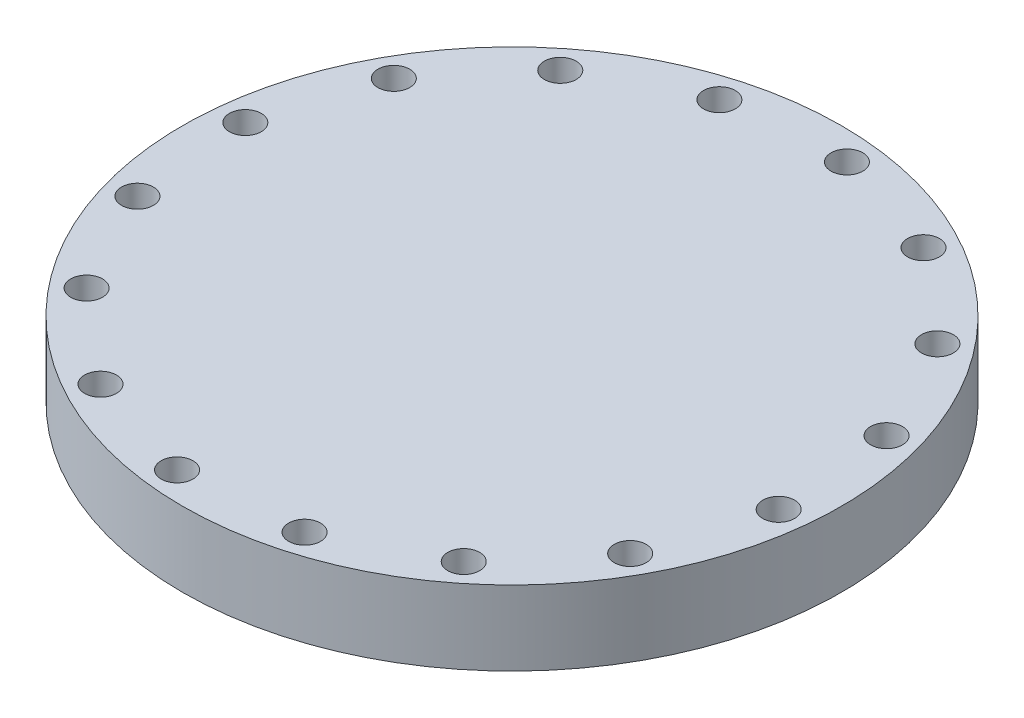
ISO-10303-21;
HEADER;
FILE_DESCRIPTION(('STEP AP214'),'2;1');
FILE_NAME('part.step','',(''),(''),'','','');
FILE_SCHEMA(('AUTOMOTIVE_DESIGN { 1 0 10303 214 1 1 1 1 }'));
ENDSEC;
DATA;
#1=APPLICATION_CONTEXT('core data for automotive mechanical design processes');
#2=APPLICATION_PROTOCOL_DEFINITION('international standard','automotive_design',2000,#1);
#3=PRODUCT_CONTEXT('',#1,'mechanical');
#4=PRODUCT('Part','Part','',(#3));
#5=PRODUCT_RELATED_PRODUCT_CATEGORY('part','',(#4));
#6=PRODUCT_DEFINITION_FORMATION('','',#4);
#7=PRODUCT_DEFINITION_CONTEXT('part definition',#1,'design');
#8=PRODUCT_DEFINITION('design','',#6,#7);
#9=PRODUCT_DEFINITION_SHAPE('','',#8);
#10=(LENGTH_UNIT() NAMED_UNIT(*) SI_UNIT(.MILLI.,.METRE.));
#11=(NAMED_UNIT(*) PLANE_ANGLE_UNIT() SI_UNIT($,.RADIAN.));
#12=(NAMED_UNIT(*) SI_UNIT($,.STERADIAN.) SOLID_ANGLE_UNIT());
#13=UNCERTAINTY_MEASURE_WITH_UNIT(LENGTH_MEASURE(1.E-05),#10,'distance_accuracy_value','');
#14=(GEOMETRIC_REPRESENTATION_CONTEXT(3) GLOBAL_UNCERTAINTY_ASSIGNED_CONTEXT((#13)) GLOBAL_UNIT_ASSIGNED_CONTEXT((#10,
#11,#12)) REPRESENTATION_CONTEXT('',''));
#15=CARTESIAN_POINT('',(0.,0.,0.));
#16=DIRECTION('',(0.,0.,1.));
#17=DIRECTION('',(1.,0.,0.));
#18=AXIS2_PLACEMENT_3D('',#15,#16,#17);
#19=CARTESIAN_POINT('',(0.,2.925,0.));
#20=DIRECTION('',(0.,-1.,0.));
#21=DIRECTION('',(0.,0.,-1.));
#22=AXIS2_PLACEMENT_3D('',#19,#20,#21);
#23=CYLINDRICAL_SURFACE('',#22,25.85370091);
#24=CARTESIAN_POINT('',(0.,2.925,0.));
#25=DIRECTION('',(0.,1.,0.));
#26=DIRECTION('',(0.,0.,1.));
#27=AXIS2_PLACEMENT_3D('',#24,#25,#26);
#28=CIRCLE('',#27,25.85370091);
#29=CARTESIAN_POINT('',(0.,2.925,25.85370091));
#30=VERTEX_POINT('',#29);
#31=EDGE_CURVE('E10',#30,#30,#28,.T.);
#32=ORIENTED_EDGE('',*,*,#31,.F.);
#33=EDGE_LOOP('',(#32));
#34=FACE_BOUND('',#33,.T.);
#35=CARTESIAN_POINT('',(0.,-2.925,0.));
#36=DIRECTION('',(0.,1.,0.));
#37=DIRECTION('',(0.,0.,1.));
#38=AXIS2_PLACEMENT_3D('',#35,#36,#37);
#39=CIRCLE('',#38,25.85370091);
#40=CARTESIAN_POINT('',(0.,-2.925,25.85370091));
#41=VERTEX_POINT('',#40);
#42=EDGE_CURVE('E40',#41,#41,#39,.T.);
#43=ORIENTED_EDGE('',*,*,#42,.T.);
#44=EDGE_LOOP('',(#43));
#45=FACE_BOUND('',#44,.T.);
#46=ADVANCED_FACE('F37',(#34,#45),#23,.T.);
#47=CARTESIAN_POINT('',(0.,2.925,0.));
#48=DIRECTION('',(0.,1.,0.));
#49=DIRECTION('',(0.,0.,1.));
#50=AXIS2_PLACEMENT_3D('',#47,#48,#49);
#51=PLANE('',#50);
#52=CARTESIAN_POINT('',(6.5570380805478,2.925,22.8269084987493));
#53=DIRECTION('',(0.,-1.,0.));
#54=DIRECTION('',(0.,0.,-1.));
#55=AXIS2_PLACEMENT_3D('',#52,#53,#54);
#56=CIRCLE('',#55,1.25);
#57=CARTESIAN_POINT('',(6.5570380805478,2.925,21.5769084987493));
#58=VERTEX_POINT('',#57);
#59=EDGE_CURVE('E62',#58,#58,#56,.T.);
#60=ORIENTED_EDGE('',*,*,#59,.T.);
#61=EDGE_LOOP('',(#60));
#62=FACE_BOUND('',#61,.T.);
#63=CARTESIAN_POINT('',(20.7775878842444,2.925,11.5045357017376));
#64=DIRECTION('',(0.,-1.,0.));
#65=DIRECTION('',(0.,0.,-1.));
#66=AXIS2_PLACEMENT_3D('',#63,#64,#65);
#67=CIRCLE('',#66,1.25);
#68=CARTESIAN_POINT('',(20.7775878842444,2.925,10.2545357017376));
#69=VERTEX_POINT('',#68);
#70=EDGE_CURVE('E55',#69,#69,#67,.T.);
#71=ORIENTED_EDGE('',*,*,#70,.T.);
#72=EDGE_LOOP('',(#71));
#73=FACE_BOUND('',#72,.T.);
#74=CARTESIAN_POINT('',(14.7933929711003,2.925,18.5800437136904));
#75=DIRECTION('',(0.,-1.,0.));
#76=DIRECTION('',(0.,0.,-1.));
#77=AXIS2_PLACEMENT_3D('',#74,#75,#76);
#78=CIRCLE('',#77,1.25);
#79=CARTESIAN_POINT('',(14.7933929711003,2.925,17.3300437136904));
#80=VERTEX_POINT('',#79);
#81=EDGE_CURVE('E69',#80,#80,#78,.T.);
#82=ORIENTED_EDGE('',*,*,#81,.T.);
#83=EDGE_LOOP('',(#82));
#84=FACE_BOUND('',#83,.T.);
#85=CARTESIAN_POINT('',(-2.67756641806983,2.925,23.5985833913147));
#86=DIRECTION('',(0.,-1.,0.));
#87=DIRECTION('',(0.,0.,-1.));
#88=AXIS2_PLACEMENT_3D('',#85,#86,#87);
#89=CIRCLE('',#88,1.25);
#90=CARTESIAN_POINT('',(-2.67756641806983,2.925,22.3485833913147));
#91=VERTEX_POINT('',#90);
#92=EDGE_CURVE('E68',#91,#91,#89,.T.);
#93=ORIENTED_EDGE('',*,*,#92,.T.);
#94=EDGE_LOOP('',(#93));
#95=FACE_BOUND('',#94,.T.);
#96=CARTESIAN_POINT('',(-11.5045357017362,2.925,20.7775878842435));
#97=DIRECTION('',(0.,-1.,0.));
#98=DIRECTION('',(0.,0.,-1.));
#99=AXIS2_PLACEMENT_3D('',#96,#97,#98);
#100=CIRCLE('',#99,1.24999999999997);
#101=CARTESIAN_POINT('',(-11.5045357017362,2.925,19.5275878842435));
#102=VERTEX_POINT('',#101);
#103=EDGE_CURVE('E79',#102,#102,#100,.T.);
#104=ORIENTED_EDGE('',*,*,#103,.T.);
#105=EDGE_LOOP('',(#104));
#106=FACE_BOUND('',#105,.T.);
#107=CARTESIAN_POINT('',(-18.5800437136888,2.925,14.7933929710995));
#108=DIRECTION('',(0.,-1.,0.));
#109=DIRECTION('',(0.,0.,-1.));
#110=AXIS2_PLACEMENT_3D('',#107,#108,#109);
#111=CIRCLE('',#110,1.25);
#112=CARTESIAN_POINT('',(-18.5800437136888,2.925,13.5433929710995));
#113=VERTEX_POINT('',#112);
#114=EDGE_CURVE('E85',#113,#113,#111,.T.);
#115=ORIENTED_EDGE('',*,*,#114,.T.);
#116=EDGE_LOOP('',(#115));
#117=FACE_BOUND('',#116,.T.);
#118=CARTESIAN_POINT('',(-22.8269084987479,2.925,6.5570380805468));
#119=DIRECTION('',(0.,-1.,0.));
#120=DIRECTION('',(0.,0.,-1.));
#121=AXIS2_PLACEMENT_3D('',#118,#119,#120);
#122=CIRCLE('',#121,1.25000000000003);
#123=CARTESIAN_POINT('',(-22.8269084987479,2.925,5.30703808054678));
#124=VERTEX_POINT('',#123);
#125=EDGE_CURVE('E91',#124,#124,#122,.T.);
#126=ORIENTED_EDGE('',*,*,#125,.T.);
#127=EDGE_LOOP('',(#126));
#128=FACE_BOUND('',#127,.T.);
#129=CARTESIAN_POINT('',(-23.5985833913132,2.925,-2.67756641807084));
#130=DIRECTION('',(0.,-1.,0.));
#131=DIRECTION('',(0.,0.,-1.));
#132=AXIS2_PLACEMENT_3D('',#129,#130,#131);
#133=CIRCLE('',#132,1.25);
#134=CARTESIAN_POINT('',(-23.5985833913132,2.925,-3.92756641807084));
#135=VERTEX_POINT('',#134);
#136=EDGE_CURVE('E97',#135,#135,#133,.T.);
#137=ORIENTED_EDGE('',*,*,#136,.T.);
#138=EDGE_LOOP('',(#137));
#139=FACE_BOUND('',#138,.T.);
#140=CARTESIAN_POINT('',(-20.777587884242,2.925,-11.5045357017372));
#141=DIRECTION('',(0.,-1.,0.));
#142=DIRECTION('',(0.,0.,-1.));
#143=AXIS2_PLACEMENT_3D('',#140,#141,#142);
#144=CIRCLE('',#143,1.25);
#145=CARTESIAN_POINT('',(-20.777587884242,2.925,-12.7545357017372));
#146=VERTEX_POINT('',#145);
#147=EDGE_CURVE('E103',#146,#146,#144,.T.);
#148=ORIENTED_EDGE('',*,*,#147,.T.);
#149=EDGE_LOOP('',(#148));
#150=FACE_BOUND('',#149,.T.);
#151=CARTESIAN_POINT('',(-14.7933929710979,2.925,-18.5800437136898));
#152=DIRECTION('',(0.,-1.,0.));
#153=DIRECTION('',(0.,0.,-1.));
#154=AXIS2_PLACEMENT_3D('',#151,#152,#153);
#155=CIRCLE('',#154,1.25);
#156=CARTESIAN_POINT('',(-14.7933929710979,2.925,-19.8300437136898));
#157=VERTEX_POINT('',#156);
#158=EDGE_CURVE('E109',#157,#157,#155,.T.);
#159=ORIENTED_EDGE('',*,*,#158,.T.);
#160=EDGE_LOOP('',(#159));
#161=FACE_BOUND('',#160,.T.);
#162=CARTESIAN_POINT('',(-6.5570380805456,2.925,-22.8269084987487));
#163=DIRECTION('',(0.,-1.,0.));
#164=DIRECTION('',(0.,0.,-1.));
#165=AXIS2_PLACEMENT_3D('',#162,#163,#164);
#166=CIRCLE('',#165,1.25);
#167=CARTESIAN_POINT('',(-6.5570380805456,2.925,-24.0769084987487));
#168=VERTEX_POINT('',#167);
#169=EDGE_CURVE('E115',#168,#168,#166,.T.);
#170=ORIENTED_EDGE('',*,*,#169,.T.);
#171=EDGE_LOOP('',(#170));
#172=FACE_BOUND('',#171,.T.);
#173=CARTESIAN_POINT('',(2.67756641807205,2.925,-23.5985833913141));
#174=DIRECTION('',(0.,-1.,0.));
#175=DIRECTION('',(0.,0.,-1.));
#176=AXIS2_PLACEMENT_3D('',#173,#174,#175);
#177=CIRCLE('',#176,1.25);
#178=CARTESIAN_POINT('',(2.67756641807205,2.925,-24.8485833913141));
#179=VERTEX_POINT('',#178);
#180=EDGE_CURVE('E121',#179,#179,#177,.T.);
#181=ORIENTED_EDGE('',*,*,#180,.T.);
#182=EDGE_LOOP('',(#181));
#183=FACE_BOUND('',#182,.T.);
#184=CARTESIAN_POINT('',(11.5045357017384,2.925,-20.777587884243));
#185=DIRECTION('',(0.,-1.,0.));
#186=DIRECTION('',(0.,0.,-1.));
#187=AXIS2_PLACEMENT_3D('',#184,#185,#186);
#188=CIRCLE('',#187,1.25);
#189=CARTESIAN_POINT('',(11.5045357017384,2.925,-22.027587884243));
#190=VERTEX_POINT('',#189);
#191=EDGE_CURVE('E127',#190,#190,#188,.T.);
#192=ORIENTED_EDGE('',*,*,#191,.T.);
#193=EDGE_LOOP('',(#192));
#194=FACE_BOUND('',#193,.T.);
#195=CARTESIAN_POINT('',(18.5800437136911,2.925,-14.7933929710991));
#196=DIRECTION('',(0.,-1.,0.));
#197=DIRECTION('',(0.,0.,-1.));
#198=AXIS2_PLACEMENT_3D('',#195,#196,#197);
#199=CIRCLE('',#198,1.25);
#200=CARTESIAN_POINT('',(18.5800437136911,2.925,-16.0433929710991));
#201=VERTEX_POINT('',#200);
#202=EDGE_CURVE('E133',#201,#201,#199,.T.);
#203=ORIENTED_EDGE('',*,*,#202,.T.);
#204=EDGE_LOOP('',(#203));
#205=FACE_BOUND('',#204,.T.);
#206=CARTESIAN_POINT('',(23.5985833913156,2.925,2.67756641807121));
#207=DIRECTION('',(0.,-1.,0.));
#208=DIRECTION('',(0.,0.,-1.));
#209=AXIS2_PLACEMENT_3D('',#206,#207,#208);
#210=CIRCLE('',#209,1.24999999999999);
#211=CARTESIAN_POINT('',(23.5985833913156,2.925,1.42756641807122));
#212=VERTEX_POINT('',#211);
#213=EDGE_CURVE('E139',#212,#212,#210,.T.);
#214=ORIENTED_EDGE('',*,*,#213,.T.);
#215=EDGE_LOOP('',(#214));
#216=FACE_BOUND('',#215,.T.);
#217=CARTESIAN_POINT('',(22.8269084987502,2.925,-6.55703808054647));
#218=DIRECTION('',(0.,-1.,0.));
#219=DIRECTION('',(0.,0.,-1.));
#220=AXIS2_PLACEMENT_3D('',#217,#218,#219);
#221=CIRCLE('',#220,1.25000000000003);
#222=CARTESIAN_POINT('',(22.8269084987502,2.925,-7.80703808054649));
#223=VERTEX_POINT('',#222);
#224=EDGE_CURVE('E47',#223,#223,#221,.T.);
#225=ORIENTED_EDGE('',*,*,#224,.T.);
#226=EDGE_LOOP('',(#225));
#227=FACE_BOUND('',#226,.T.);
#228=ORIENTED_EDGE('',*,*,#31,.T.);
#229=EDGE_LOOP('',(#228));
#230=FACE_BOUND('',#229,.T.);
#231=ADVANCED_FACE('F152',(#62,#73,#84,#95,#106,#117,#128,#139,#150,#161,#172,#183,#194,#205,
#216,#227,#230),#51,.T.);
#232=CARTESIAN_POINT('',(0.,-2.925,0.));
#233=DIRECTION('',(0.,1.,0.));
#234=DIRECTION('',(0.,0.,1.));
#235=AXIS2_PLACEMENT_3D('',#232,#233,#234);
#236=PLANE('',#235);
#237=CARTESIAN_POINT('',(6.5570380805478,-2.925,22.8269084987493));
#238=DIRECTION('',(0.,-1.,0.));
#239=DIRECTION('',(0.,0.,-1.));
#240=AXIS2_PLACEMENT_3D('',#237,#238,#239);
#241=CIRCLE('',#240,1.25);
#242=CARTESIAN_POINT('',(6.5570380805478,-2.925,21.5769084987493));
#243=VERTEX_POINT('',#242);
#244=EDGE_CURVE('E65',#243,#243,#241,.T.);
#245=ORIENTED_EDGE('',*,*,#244,.F.);
#246=EDGE_LOOP('',(#245));
#247=FACE_BOUND('',#246,.T.);
#248=CARTESIAN_POINT('',(20.7775878842444,-2.925,11.5045357017376));
#249=DIRECTION('',(0.,-1.,0.));
#250=DIRECTION('',(0.,0.,-1.));
#251=AXIS2_PLACEMENT_3D('',#248,#249,#250);
#252=CIRCLE('',#251,1.25);
#253=CARTESIAN_POINT('',(20.7775878842444,-2.925,10.2545357017376));
#254=VERTEX_POINT('',#253);
#255=EDGE_CURVE('E58',#254,#254,#252,.T.);
#256=ORIENTED_EDGE('',*,*,#255,.F.);
#257=EDGE_LOOP('',(#256));
#258=FACE_BOUND('',#257,.T.);
#259=CARTESIAN_POINT('',(14.7933929711003,-2.925,18.5800437136904));
#260=DIRECTION('',(0.,-1.,0.));
#261=DIRECTION('',(0.,0.,-1.));
#262=AXIS2_PLACEMENT_3D('',#259,#260,#261);
#263=CIRCLE('',#262,1.25);
#264=CARTESIAN_POINT('',(14.7933929711003,-2.925,17.3300437136904));
#265=VERTEX_POINT('',#264);
#266=EDGE_CURVE('E59',#265,#265,#263,.T.);
#267=ORIENTED_EDGE('',*,*,#266,.F.);
#268=EDGE_LOOP('',(#267));
#269=FACE_BOUND('',#268,.T.);
#270=CARTESIAN_POINT('',(-2.67756641806983,-2.925,23.5985833913147));
#271=DIRECTION('',(0.,-1.,0.));
#272=DIRECTION('',(0.,0.,-1.));
#273=AXIS2_PLACEMENT_3D('',#270,#271,#272);
#274=CIRCLE('',#273,1.25);
#275=CARTESIAN_POINT('',(-2.67756641806983,-2.925,22.3485833913147));
#276=VERTEX_POINT('',#275);
#277=EDGE_CURVE('E76',#276,#276,#274,.T.);
#278=ORIENTED_EDGE('',*,*,#277,.F.);
#279=EDGE_LOOP('',(#278));
#280=FACE_BOUND('',#279,.T.);
#281=CARTESIAN_POINT('',(-11.5045357017362,-2.925,20.7775878842435));
#282=DIRECTION('',(0.,-1.,0.));
#283=DIRECTION('',(0.,0.,-1.));
#284=AXIS2_PLACEMENT_3D('',#281,#282,#283);
#285=CIRCLE('',#284,1.24999999999997);
#286=CARTESIAN_POINT('',(-11.5045357017362,-2.925,19.5275878842435));
#287=VERTEX_POINT('',#286);
#288=EDGE_CURVE('E82',#287,#287,#285,.T.);
#289=ORIENTED_EDGE('',*,*,#288,.F.);
#290=EDGE_LOOP('',(#289));
#291=FACE_BOUND('',#290,.T.);
#292=CARTESIAN_POINT('',(-18.5800437136888,-2.925,14.7933929710995));
#293=DIRECTION('',(0.,-1.,0.));
#294=DIRECTION('',(0.,0.,-1.));
#295=AXIS2_PLACEMENT_3D('',#292,#293,#294);
#296=CIRCLE('',#295,1.25);
#297=CARTESIAN_POINT('',(-18.5800437136888,-2.925,13.5433929710995));
#298=VERTEX_POINT('',#297);
#299=EDGE_CURVE('E88',#298,#298,#296,.T.);
#300=ORIENTED_EDGE('',*,*,#299,.F.);
#301=EDGE_LOOP('',(#300));
#302=FACE_BOUND('',#301,.T.);
#303=CARTESIAN_POINT('',(-22.8269084987479,-2.925,6.5570380805468));
#304=DIRECTION('',(0.,-1.,0.));
#305=DIRECTION('',(0.,0.,-1.));
#306=AXIS2_PLACEMENT_3D('',#303,#304,#305);
#307=CIRCLE('',#306,1.25000000000003);
#308=CARTESIAN_POINT('',(-22.8269084987479,-2.925,5.30703808054678));
#309=VERTEX_POINT('',#308);
#310=EDGE_CURVE('E94',#309,#309,#307,.T.);
#311=ORIENTED_EDGE('',*,*,#310,.F.);
#312=EDGE_LOOP('',(#311));
#313=FACE_BOUND('',#312,.T.);
#314=CARTESIAN_POINT('',(-23.5985833913132,-2.925,-2.67756641807084));
#315=DIRECTION('',(0.,-1.,0.));
#316=DIRECTION('',(0.,0.,-1.));
#317=AXIS2_PLACEMENT_3D('',#314,#315,#316);
#318=CIRCLE('',#317,1.25);
#319=CARTESIAN_POINT('',(-23.5985833913132,-2.925,-3.92756641807084));
#320=VERTEX_POINT('',#319);
#321=EDGE_CURVE('E100',#320,#320,#318,.T.);
#322=ORIENTED_EDGE('',*,*,#321,.F.);
#323=EDGE_LOOP('',(#322));
#324=FACE_BOUND('',#323,.T.);
#325=CARTESIAN_POINT('',(-20.777587884242,-2.925,-11.5045357017372));
#326=DIRECTION('',(0.,-1.,0.));
#327=DIRECTION('',(0.,0.,-1.));
#328=AXIS2_PLACEMENT_3D('',#325,#326,#327);
#329=CIRCLE('',#328,1.25);
#330=CARTESIAN_POINT('',(-20.777587884242,-2.925,-12.7545357017372));
#331=VERTEX_POINT('',#330);
#332=EDGE_CURVE('E106',#331,#331,#329,.T.);
#333=ORIENTED_EDGE('',*,*,#332,.F.);
#334=EDGE_LOOP('',(#333));
#335=FACE_BOUND('',#334,.T.);
#336=CARTESIAN_POINT('',(-14.7933929710979,-2.925,-18.5800437136898));
#337=DIRECTION('',(0.,-1.,0.));
#338=DIRECTION('',(0.,0.,-1.));
#339=AXIS2_PLACEMENT_3D('',#336,#337,#338);
#340=CIRCLE('',#339,1.25);
#341=CARTESIAN_POINT('',(-14.7933929710979,-2.925,-19.8300437136898));
#342=VERTEX_POINT('',#341);
#343=EDGE_CURVE('E112',#342,#342,#340,.T.);
#344=ORIENTED_EDGE('',*,*,#343,.F.);
#345=EDGE_LOOP('',(#344));
#346=FACE_BOUND('',#345,.T.);
#347=CARTESIAN_POINT('',(-6.5570380805456,-2.925,-22.8269084987487));
#348=DIRECTION('',(0.,-1.,0.));
#349=DIRECTION('',(0.,0.,-1.));
#350=AXIS2_PLACEMENT_3D('',#347,#348,#349);
#351=CIRCLE('',#350,1.25);
#352=CARTESIAN_POINT('',(-6.5570380805456,-2.925,-24.0769084987487));
#353=VERTEX_POINT('',#352);
#354=EDGE_CURVE('E118',#353,#353,#351,.T.);
#355=ORIENTED_EDGE('',*,*,#354,.F.);
#356=EDGE_LOOP('',(#355));
#357=FACE_BOUND('',#356,.T.);
#358=CARTESIAN_POINT('',(2.67756641807205,-2.925,-23.5985833913141));
#359=DIRECTION('',(0.,-1.,0.));
#360=DIRECTION('',(0.,0.,-1.));
#361=AXIS2_PLACEMENT_3D('',#358,#359,#360);
#362=CIRCLE('',#361,1.25);
#363=CARTESIAN_POINT('',(2.67756641807205,-2.925,-24.8485833913141));
#364=VERTEX_POINT('',#363);
#365=EDGE_CURVE('E124',#364,#364,#362,.T.);
#366=ORIENTED_EDGE('',*,*,#365,.F.);
#367=EDGE_LOOP('',(#366));
#368=FACE_BOUND('',#367,.T.);
#369=CARTESIAN_POINT('',(11.5045357017384,-2.925,-20.777587884243));
#370=DIRECTION('',(0.,-1.,0.));
#371=DIRECTION('',(0.,0.,-1.));
#372=AXIS2_PLACEMENT_3D('',#369,#370,#371);
#373=CIRCLE('',#372,1.25);
#374=CARTESIAN_POINT('',(11.5045357017384,-2.925,-22.027587884243));
#375=VERTEX_POINT('',#374);
#376=EDGE_CURVE('E130',#375,#375,#373,.T.);
#377=ORIENTED_EDGE('',*,*,#376,.F.);
#378=EDGE_LOOP('',(#377));
#379=FACE_BOUND('',#378,.T.);
#380=CARTESIAN_POINT('',(18.5800437136911,-2.925,-14.7933929710991));
#381=DIRECTION('',(0.,-1.,0.));
#382=DIRECTION('',(0.,0.,-1.));
#383=AXIS2_PLACEMENT_3D('',#380,#381,#382);
#384=CIRCLE('',#383,1.25);
#385=CARTESIAN_POINT('',(18.5800437136911,-2.925,-16.0433929710991));
#386=VERTEX_POINT('',#385);
#387=EDGE_CURVE('E136',#386,#386,#384,.T.);
#388=ORIENTED_EDGE('',*,*,#387,.F.);
#389=EDGE_LOOP('',(#388));
#390=FACE_BOUND('',#389,.T.);
#391=CARTESIAN_POINT('',(23.5985833913156,-2.925,2.67756641807121));
#392=DIRECTION('',(0.,-1.,0.));
#393=DIRECTION('',(0.,0.,-1.));
#394=AXIS2_PLACEMENT_3D('',#391,#392,#393);
#395=CIRCLE('',#394,1.24999999999999);
#396=CARTESIAN_POINT('',(23.5985833913156,-2.925,1.42756641807122));
#397=VERTEX_POINT('',#396);
#398=EDGE_CURVE('E52',#397,#397,#395,.T.);
#399=ORIENTED_EDGE('',*,*,#398,.F.);
#400=EDGE_LOOP('',(#399));
#401=FACE_BOUND('',#400,.T.);
#402=CARTESIAN_POINT('',(22.8269084987502,-2.925,-6.55703808054647));
#403=DIRECTION('',(0.,-1.,0.));
#404=DIRECTION('',(0.,0.,-1.));
#405=AXIS2_PLACEMENT_3D('',#402,#403,#404);
#406=CIRCLE('',#405,1.25000000000003);
#407=CARTESIAN_POINT('',(22.8269084987502,-2.925,-7.80703808054649));
#408=VERTEX_POINT('',#407);
#409=EDGE_CURVE('E49',#408,#408,#406,.T.);
#410=ORIENTED_EDGE('',*,*,#409,.F.);
#411=EDGE_LOOP('',(#410));
#412=FACE_BOUND('',#411,.T.);
#413=ORIENTED_EDGE('',*,*,#42,.F.);
#414=EDGE_LOOP('',(#413));
#415=FACE_BOUND('',#414,.T.);
#416=ADVANCED_FACE('F148',(#247,#258,#269,#280,#291,#302,#313,#324,#335,#346,#357,#368,#379,
#390,#401,#412,#415),#236,.F.);
#417=CARTESIAN_POINT('',(22.8269084987502,2.925,-6.55703808054647));
#418=DIRECTION('',(0.,-1.,0.));
#419=DIRECTION('',(0.,0.,-1.));
#420=AXIS2_PLACEMENT_3D('',#417,#418,#419);
#421=CYLINDRICAL_SURFACE('',#420,1.25000000000003);
#422=ORIENTED_EDGE('',*,*,#409,.T.);
#423=EDGE_LOOP('',(#422));
#424=FACE_BOUND('',#423,.T.);
#425=ORIENTED_EDGE('',*,*,#224,.F.);
#426=EDGE_LOOP('',(#425));
#427=FACE_BOUND('',#426,.T.);
#428=ADVANCED_FACE('F151',(#424,#427),#421,.F.);
#429=CARTESIAN_POINT('',(23.5985833913156,2.925,2.67756641807121));
#430=DIRECTION('',(0.,-1.,0.));
#431=DIRECTION('',(0.,0.,-1.));
#432=AXIS2_PLACEMENT_3D('',#429,#430,#431);
#433=CYLINDRICAL_SURFACE('',#432,1.24999999999999);
#434=ORIENTED_EDGE('',*,*,#398,.T.);
#435=EDGE_LOOP('',(#434));
#436=FACE_BOUND('',#435,.T.);
#437=ORIENTED_EDGE('',*,*,#213,.F.);
#438=EDGE_LOOP('',(#437));
#439=FACE_BOUND('',#438,.T.);
#440=ADVANCED_FACE('F145',(#436,#439),#433,.F.);
#441=CARTESIAN_POINT('',(18.5800437136911,2.925,-14.7933929710991));
#442=DIRECTION('',(0.,-1.,0.));
#443=DIRECTION('',(0.,0.,-1.));
#444=AXIS2_PLACEMENT_3D('',#441,#442,#443);
#445=CYLINDRICAL_SURFACE('',#444,1.25);
#446=ORIENTED_EDGE('',*,*,#387,.T.);
#447=EDGE_LOOP('',(#446));
#448=FACE_BOUND('',#447,.T.);
#449=ORIENTED_EDGE('',*,*,#202,.F.);
#450=EDGE_LOOP('',(#449));
#451=FACE_BOUND('',#450,.T.);
#452=ADVANCED_FACE('F223',(#448,#451),#445,.F.);
#453=CARTESIAN_POINT('',(11.5045357017384,2.925,-20.777587884243));
#454=DIRECTION('',(0.,-1.,0.));
#455=DIRECTION('',(0.,0.,-1.));
#456=AXIS2_PLACEMENT_3D('',#453,#454,#455);
#457=CYLINDRICAL_SURFACE('',#456,1.25);
#458=ORIENTED_EDGE('',*,*,#376,.T.);
#459=EDGE_LOOP('',(#458));
#460=FACE_BOUND('',#459,.T.);
#461=ORIENTED_EDGE('',*,*,#191,.F.);
#462=EDGE_LOOP('',(#461));
#463=FACE_BOUND('',#462,.T.);
#464=ADVANCED_FACE('F219',(#460,#463),#457,.F.);
#465=CARTESIAN_POINT('',(2.67756641807205,2.925,-23.5985833913141));
#466=DIRECTION('',(0.,-1.,0.));
#467=DIRECTION('',(0.,0.,-1.));
#468=AXIS2_PLACEMENT_3D('',#465,#466,#467);
#469=CYLINDRICAL_SURFACE('',#468,1.25);
#470=ORIENTED_EDGE('',*,*,#365,.T.);
#471=EDGE_LOOP('',(#470));
#472=FACE_BOUND('',#471,.T.);
#473=ORIENTED_EDGE('',*,*,#180,.F.);
#474=EDGE_LOOP('',(#473));
#475=FACE_BOUND('',#474,.T.);
#476=ADVANCED_FACE('F215',(#472,#475),#469,.F.);
#477=CARTESIAN_POINT('',(-6.5570380805456,2.925,-22.8269084987487));
#478=DIRECTION('',(0.,-1.,0.));
#479=DIRECTION('',(0.,0.,-1.));
#480=AXIS2_PLACEMENT_3D('',#477,#478,#479);
#481=CYLINDRICAL_SURFACE('',#480,1.25);
#482=ORIENTED_EDGE('',*,*,#354,.T.);
#483=EDGE_LOOP('',(#482));
#484=FACE_BOUND('',#483,.T.);
#485=ORIENTED_EDGE('',*,*,#169,.F.);
#486=EDGE_LOOP('',(#485));
#487=FACE_BOUND('',#486,.T.);
#488=ADVANCED_FACE('F211',(#484,#487),#481,.F.);
#489=CARTESIAN_POINT('',(-14.7933929710979,2.925,-18.5800437136898));
#490=DIRECTION('',(0.,-1.,0.));
#491=DIRECTION('',(0.,0.,-1.));
#492=AXIS2_PLACEMENT_3D('',#489,#490,#491);
#493=CYLINDRICAL_SURFACE('',#492,1.25);
#494=ORIENTED_EDGE('',*,*,#343,.T.);
#495=EDGE_LOOP('',(#494));
#496=FACE_BOUND('',#495,.T.);
#497=ORIENTED_EDGE('',*,*,#158,.F.);
#498=EDGE_LOOP('',(#497));
#499=FACE_BOUND('',#498,.T.);
#500=ADVANCED_FACE('F207',(#496,#499),#493,.F.);
#501=CARTESIAN_POINT('',(-20.777587884242,2.925,-11.5045357017372));
#502=DIRECTION('',(0.,-1.,0.));
#503=DIRECTION('',(0.,0.,-1.));
#504=AXIS2_PLACEMENT_3D('',#501,#502,#503);
#505=CYLINDRICAL_SURFACE('',#504,1.25);
#506=ORIENTED_EDGE('',*,*,#332,.T.);
#507=EDGE_LOOP('',(#506));
#508=FACE_BOUND('',#507,.T.);
#509=ORIENTED_EDGE('',*,*,#147,.F.);
#510=EDGE_LOOP('',(#509));
#511=FACE_BOUND('',#510,.T.);
#512=ADVANCED_FACE('F203',(#508,#511),#505,.F.);
#513=CARTESIAN_POINT('',(-23.5985833913132,2.925,-2.67756641807084));
#514=DIRECTION('',(0.,-1.,0.));
#515=DIRECTION('',(0.,0.,-1.));
#516=AXIS2_PLACEMENT_3D('',#513,#514,#515);
#517=CYLINDRICAL_SURFACE('',#516,1.25);
#518=ORIENTED_EDGE('',*,*,#321,.T.);
#519=EDGE_LOOP('',(#518));
#520=FACE_BOUND('',#519,.T.);
#521=ORIENTED_EDGE('',*,*,#136,.F.);
#522=EDGE_LOOP('',(#521));
#523=FACE_BOUND('',#522,.T.);
#524=ADVANCED_FACE('F199',(#520,#523),#517,.F.);
#525=CARTESIAN_POINT('',(-22.8269084987479,2.925,6.5570380805468));
#526=DIRECTION('',(0.,-1.,0.));
#527=DIRECTION('',(0.,0.,-1.));
#528=AXIS2_PLACEMENT_3D('',#525,#526,#527);
#529=CYLINDRICAL_SURFACE('',#528,1.25000000000003);
#530=ORIENTED_EDGE('',*,*,#310,.T.);
#531=EDGE_LOOP('',(#530));
#532=FACE_BOUND('',#531,.T.);
#533=ORIENTED_EDGE('',*,*,#125,.F.);
#534=EDGE_LOOP('',(#533));
#535=FACE_BOUND('',#534,.T.);
#536=ADVANCED_FACE('F195',(#532,#535),#529,.F.);
#537=CARTESIAN_POINT('',(-18.5800437136888,2.925,14.7933929710995));
#538=DIRECTION('',(0.,-1.,0.));
#539=DIRECTION('',(0.,0.,-1.));
#540=AXIS2_PLACEMENT_3D('',#537,#538,#539);
#541=CYLINDRICAL_SURFACE('',#540,1.25);
#542=ORIENTED_EDGE('',*,*,#299,.T.);
#543=EDGE_LOOP('',(#542));
#544=FACE_BOUND('',#543,.T.);
#545=ORIENTED_EDGE('',*,*,#114,.F.);
#546=EDGE_LOOP('',(#545));
#547=FACE_BOUND('',#546,.T.);
#548=ADVANCED_FACE('F191',(#544,#547),#541,.F.);
#549=CARTESIAN_POINT('',(-11.5045357017362,2.925,20.7775878842435));
#550=DIRECTION('',(0.,-1.,0.));
#551=DIRECTION('',(0.,0.,-1.));
#552=AXIS2_PLACEMENT_3D('',#549,#550,#551);
#553=CYLINDRICAL_SURFACE('',#552,1.24999999999997);
#554=ORIENTED_EDGE('',*,*,#288,.T.);
#555=EDGE_LOOP('',(#554));
#556=FACE_BOUND('',#555,.T.);
#557=ORIENTED_EDGE('',*,*,#103,.F.);
#558=EDGE_LOOP('',(#557));
#559=FACE_BOUND('',#558,.T.);
#560=ADVANCED_FACE('F187',(#556,#559),#553,.F.);
#561=CARTESIAN_POINT('',(-2.67756641806983,2.925,23.5985833913147));
#562=DIRECTION('',(0.,-1.,0.));
#563=DIRECTION('',(0.,0.,-1.));
#564=AXIS2_PLACEMENT_3D('',#561,#562,#563);
#565=CYLINDRICAL_SURFACE('',#564,1.25);
#566=ORIENTED_EDGE('',*,*,#277,.T.);
#567=EDGE_LOOP('',(#566));
#568=FACE_BOUND('',#567,.T.);
#569=ORIENTED_EDGE('',*,*,#92,.F.);
#570=EDGE_LOOP('',(#569));
#571=FACE_BOUND('',#570,.T.);
#572=ADVANCED_FACE('F183',(#568,#571),#565,.F.);
#573=CARTESIAN_POINT('',(14.7933929711003,2.925,18.5800437136904));
#574=DIRECTION('',(0.,-1.,0.));
#575=DIRECTION('',(0.,0.,-1.));
#576=AXIS2_PLACEMENT_3D('',#573,#574,#575);
#577=CYLINDRICAL_SURFACE('',#576,1.25);
#578=ORIENTED_EDGE('',*,*,#266,.T.);
#579=EDGE_LOOP('',(#578));
#580=FACE_BOUND('',#579,.T.);
#581=ORIENTED_EDGE('',*,*,#81,.F.);
#582=EDGE_LOOP('',(#581));
#583=FACE_BOUND('',#582,.T.);
#584=ADVANCED_FACE('F176',(#580,#583),#577,.F.);
#585=CARTESIAN_POINT('',(20.7775878842444,2.925,11.5045357017376));
#586=DIRECTION('',(0.,-1.,0.));
#587=DIRECTION('',(0.,0.,-1.));
#588=AXIS2_PLACEMENT_3D('',#585,#586,#587);
#589=CYLINDRICAL_SURFACE('',#588,1.25);
#590=ORIENTED_EDGE('',*,*,#255,.T.);
#591=EDGE_LOOP('',(#590));
#592=FACE_BOUND('',#591,.T.);
#593=ORIENTED_EDGE('',*,*,#70,.F.);
#594=EDGE_LOOP('',(#593));
#595=FACE_BOUND('',#594,.T.);
#596=ADVANCED_FACE('F172',(#592,#595),#589,.F.);
#597=CARTESIAN_POINT('',(6.5570380805478,2.925,22.8269084987493));
#598=DIRECTION('',(0.,-1.,0.));
#599=DIRECTION('',(0.,0.,-1.));
#600=AXIS2_PLACEMENT_3D('',#597,#598,#599);
#601=CYLINDRICAL_SURFACE('',#600,1.25);
#602=ORIENTED_EDGE('',*,*,#244,.T.);
#603=EDGE_LOOP('',(#602));
#604=FACE_BOUND('',#603,.T.);
#605=ORIENTED_EDGE('',*,*,#59,.F.);
#606=EDGE_LOOP('',(#605));
#607=FACE_BOUND('',#606,.T.);
#608=ADVANCED_FACE('F175',(#604,#607),#601,.F.);
#609=CLOSED_SHELL('',(#46,#231,#416,#428,#440,#452,#464,#476,#488,#500,#512,#524,#536,#548,#560,
#572,#584,#596,#608));
#610=MANIFOLD_SOLID_BREP('B2',#609);
#611=ADVANCED_BREP_SHAPE_REPRESENTATION('',(#18,#610),#14);
#612=SHAPE_DEFINITION_REPRESENTATION(#9,#611);
ENDSEC;
END-ISO-10303-21;
